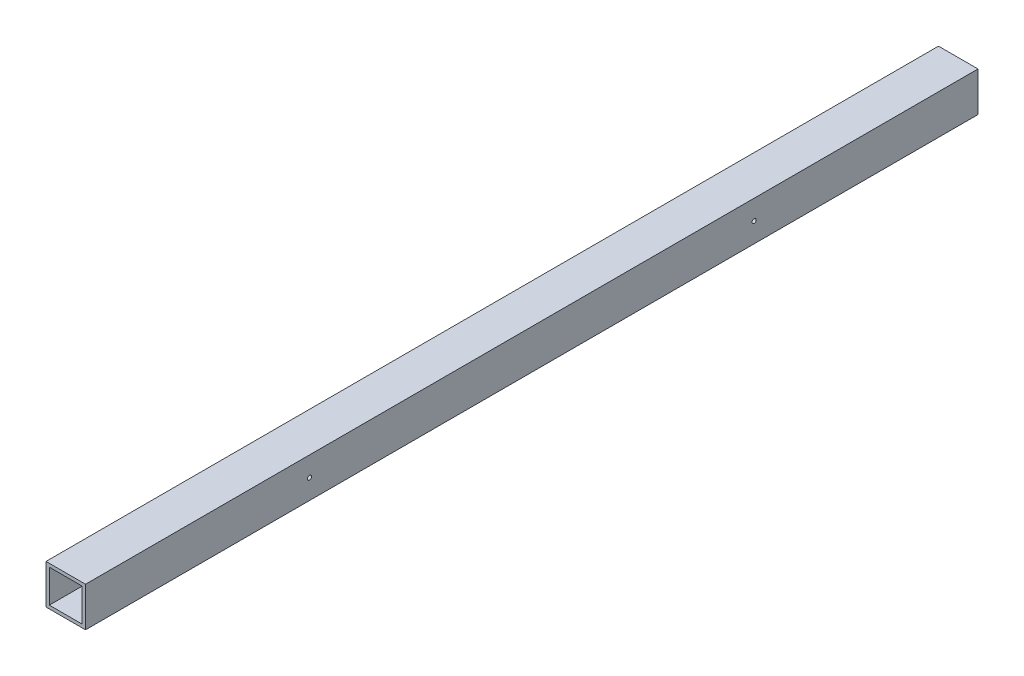
ISO-10303-21;
HEADER;
FILE_DESCRIPTION(('STEP AP214'),'2;1');
FILE_NAME('part.step','',(''),(''),'','','');
FILE_SCHEMA(('AUTOMOTIVE_DESIGN { 1 0 10303 214 1 1 1 1 }'));
ENDSEC;
DATA;
#1=APPLICATION_CONTEXT('core data for automotive mechanical design processes');
#2=APPLICATION_PROTOCOL_DEFINITION('international standard','automotive_design',2000,#1);
#3=PRODUCT_CONTEXT('',#1,'mechanical');
#4=PRODUCT('Part','Part','',(#3));
#5=PRODUCT_RELATED_PRODUCT_CATEGORY('part','',(#4));
#6=PRODUCT_DEFINITION_FORMATION('','',#4);
#7=PRODUCT_DEFINITION_CONTEXT('part definition',#1,'design');
#8=PRODUCT_DEFINITION('design','',#6,#7);
#9=PRODUCT_DEFINITION_SHAPE('','',#8);
#10=(LENGTH_UNIT() NAMED_UNIT(*) SI_UNIT(.MILLI.,.METRE.));
#11=(NAMED_UNIT(*) PLANE_ANGLE_UNIT() SI_UNIT($,.RADIAN.));
#12=(NAMED_UNIT(*) SI_UNIT($,.STERADIAN.) SOLID_ANGLE_UNIT());
#13=UNCERTAINTY_MEASURE_WITH_UNIT(LENGTH_MEASURE(1.E-05),#10,'distance_accuracy_value','');
#14=(GEOMETRIC_REPRESENTATION_CONTEXT(3) GLOBAL_UNCERTAINTY_ASSIGNED_CONTEXT((#13)) GLOBAL_UNIT_ASSIGNED_CONTEXT((#10,
#11,#12)) REPRESENTATION_CONTEXT('',''));
#15=CARTESIAN_POINT('',(0.,0.,0.));
#16=DIRECTION('',(0.,0.,1.));
#17=DIRECTION('',(1.,0.,0.));
#18=AXIS2_PLACEMENT_3D('',#15,#16,#17);
#19=CARTESIAN_POINT('',(0.,0.,271.));
#20=DIRECTION('',(0.,0.,1.));
#21=DIRECTION('',(1.,0.,0.));
#22=AXIS2_PLACEMENT_3D('',#19,#20,#21);
#23=PLANE('',#22);
#24=DIRECTION('',(0.,-1.,0.));
#25=VECTOR('',#24,1.);
#26=CARTESIAN_POINT('',(-12.,12.,271.));
#27=LINE('',#26,#25);
#28=CARTESIAN_POINT('',(-12.,12.,271.));
#29=VERTEX_POINT('',#28);
#30=CARTESIAN_POINT('',(-12.,-12.,271.));
#31=VERTEX_POINT('',#30);
#32=EDGE_CURVE('E139',#29,#31,#27,.T.);
#33=ORIENTED_EDGE('',*,*,#32,.T.);
#34=DIRECTION('',(1.,0.,0.));
#35=VECTOR('',#34,1.);
#36=CARTESIAN_POINT('',(-12.,-12.,271.));
#37=LINE('',#36,#35);
#38=CARTESIAN_POINT('',(12.,-12.,271.));
#39=VERTEX_POINT('',#38);
#40=EDGE_CURVE('E142',#31,#39,#37,.T.);
#41=ORIENTED_EDGE('',*,*,#40,.T.);
#42=DIRECTION('',(0.,1.,0.));
#43=VECTOR('',#42,1.);
#44=CARTESIAN_POINT('',(12.,12.,271.));
#45=LINE('',#44,#43);
#46=CARTESIAN_POINT('',(12.,12.,271.));
#47=VERTEX_POINT('',#46);
#48=EDGE_CURVE('E145',#39,#47,#45,.T.);
#49=ORIENTED_EDGE('',*,*,#48,.T.);
#50=DIRECTION('',(-1.,0.,0.));
#51=VECTOR('',#50,1.);
#52=CARTESIAN_POINT('',(-12.,12.,271.));
#53=LINE('',#52,#51);
#54=EDGE_CURVE('E147',#47,#29,#53,.T.);
#55=ORIENTED_EDGE('',*,*,#54,.T.);
#56=EDGE_LOOP('',(#33,#41,#49,#55));
#57=FACE_BOUND('',#56,.T.);
#58=DIRECTION('',(-1.,0.,0.));
#59=VECTOR('',#58,1.);
#60=CARTESIAN_POINT('',(-10.,10.,271.));
#61=LINE('',#60,#59);
#62=CARTESIAN_POINT('',(10.,10.,271.));
#63=VERTEX_POINT('',#62);
#64=CARTESIAN_POINT('',(-10.,10.,271.));
#65=VERTEX_POINT('',#64);
#66=EDGE_CURVE('E109',#63,#65,#61,.T.);
#67=ORIENTED_EDGE('',*,*,#66,.F.);
#68=DIRECTION('',(0.,1.,0.));
#69=VECTOR('',#68,1.);
#70=CARTESIAN_POINT('',(10.,10.,271.));
#71=LINE('',#70,#69);
#72=CARTESIAN_POINT('',(10.,-10.,271.));
#73=VERTEX_POINT('',#72);
#74=EDGE_CURVE('E101',#73,#63,#71,.T.);
#75=ORIENTED_EDGE('',*,*,#74,.F.);
#76=DIRECTION('',(1.,0.,0.));
#77=VECTOR('',#76,1.);
#78=CARTESIAN_POINT('',(-10.,-10.,271.));
#79=LINE('',#78,#77);
#80=CARTESIAN_POINT('',(-10.,-10.,271.));
#81=VERTEX_POINT('',#80);
#82=EDGE_CURVE('E123',#81,#73,#79,.T.);
#83=ORIENTED_EDGE('',*,*,#82,.F.);
#84=DIRECTION('',(0.,-1.,0.));
#85=VECTOR('',#84,1.);
#86=CARTESIAN_POINT('',(-10.,10.,271.));
#87=LINE('',#86,#85);
#88=EDGE_CURVE('E121',#65,#81,#87,.T.);
#89=ORIENTED_EDGE('',*,*,#88,.F.);
#90=EDGE_LOOP('',(#67,#75,#83,#89));
#91=FACE_BOUND('',#90,.T.);
#92=ADVANCED_FACE('F35',(#57,#91),#23,.T.);
#93=CARTESIAN_POINT('',(0.,0.,-271.));
#94=DIRECTION('',(0.,0.,1.));
#95=DIRECTION('',(1.,0.,0.));
#96=AXIS2_PLACEMENT_3D('',#93,#94,#95);
#97=PLANE('',#96);
#98=DIRECTION('',(0.,-1.,0.));
#99=VECTOR('',#98,1.);
#100=CARTESIAN_POINT('',(-12.,12.,-271.));
#101=LINE('',#100,#99);
#102=CARTESIAN_POINT('',(-12.,12.,-271.));
#103=VERTEX_POINT('',#102);
#104=CARTESIAN_POINT('',(-12.,-12.,-271.));
#105=VERTEX_POINT('',#104);
#106=EDGE_CURVE('E117',#103,#105,#101,.T.);
#107=ORIENTED_EDGE('',*,*,#106,.F.);
#108=DIRECTION('',(-1.,0.,0.));
#109=VECTOR('',#108,1.);
#110=CARTESIAN_POINT('',(-12.,12.,-271.));
#111=LINE('',#110,#109);
#112=CARTESIAN_POINT('',(12.,12.,-271.));
#113=VERTEX_POINT('',#112);
#114=EDGE_CURVE('E143',#113,#103,#111,.T.);
#115=ORIENTED_EDGE('',*,*,#114,.F.);
#116=DIRECTION('',(0.,1.,0.));
#117=VECTOR('',#116,1.);
#118=CARTESIAN_POINT('',(12.,12.,-271.));
#119=LINE('',#118,#117);
#120=CARTESIAN_POINT('',(12.,-12.,-271.));
#121=VERTEX_POINT('',#120);
#122=EDGE_CURVE('E154',#121,#113,#119,.T.);
#123=ORIENTED_EDGE('',*,*,#122,.F.);
#124=DIRECTION('',(1.,0.,0.));
#125=VECTOR('',#124,1.);
#126=CARTESIAN_POINT('',(-12.,-12.,-271.));
#127=LINE('',#126,#125);
#128=EDGE_CURVE('E152',#105,#121,#127,.T.);
#129=ORIENTED_EDGE('',*,*,#128,.F.);
#130=EDGE_LOOP('',(#107,#115,#123,#129));
#131=FACE_BOUND('',#130,.T.);
#132=DIRECTION('',(0.,1.,0.));
#133=VECTOR('',#132,1.);
#134=CARTESIAN_POINT('',(10.,10.,-271.));
#135=LINE('',#134,#133);
#136=CARTESIAN_POINT('',(10.,-10.,-271.));
#137=VERTEX_POINT('',#136);
#138=CARTESIAN_POINT('',(10.,10.,-271.));
#139=VERTEX_POINT('',#138);
#140=EDGE_CURVE('E59',#137,#139,#135,.T.);
#141=ORIENTED_EDGE('',*,*,#140,.T.);
#142=DIRECTION('',(-1.,0.,0.));
#143=VECTOR('',#142,1.);
#144=CARTESIAN_POINT('',(-10.,10.,-271.));
#145=LINE('',#144,#143);
#146=CARTESIAN_POINT('',(-10.,10.,-271.));
#147=VERTEX_POINT('',#146);
#148=EDGE_CURVE('E116',#139,#147,#145,.T.);
#149=ORIENTED_EDGE('',*,*,#148,.T.);
#150=DIRECTION('',(0.,-1.,0.));
#151=VECTOR('',#150,1.);
#152=CARTESIAN_POINT('',(-10.,10.,-271.));
#153=LINE('',#152,#151);
#154=CARTESIAN_POINT('',(-10.,-10.,-271.));
#155=VERTEX_POINT('',#154);
#156=EDGE_CURVE('E131',#147,#155,#153,.T.);
#157=ORIENTED_EDGE('',*,*,#156,.T.);
#158=DIRECTION('',(1.,0.,0.));
#159=VECTOR('',#158,1.);
#160=CARTESIAN_POINT('',(-10.,-10.,-271.));
#161=LINE('',#160,#159);
#162=EDGE_CURVE('E110',#155,#137,#161,.T.);
#163=ORIENTED_EDGE('',*,*,#162,.T.);
#164=EDGE_LOOP('',(#141,#149,#157,#163));
#165=FACE_BOUND('',#164,.T.);
#166=ADVANCED_FACE('F173',(#131,#165),#97,.F.);
#167=CARTESIAN_POINT('',(-12.,12.,271.));
#168=DIRECTION('',(1.,0.,0.));
#169=DIRECTION('',(0.,1.,0.));
#170=AXIS2_PLACEMENT_3D('',#167,#168,#169);
#171=PLANE('',#170);
#172=CARTESIAN_POINT('',(-12.,0.,135.));
#173=DIRECTION('',(-1.,0.,0.));
#174=DIRECTION('',(0.,0.,1.));
#175=AXIS2_PLACEMENT_3D('',#172,#173,#174);
#176=CIRCLE('',#175,1.24999999999999);
#177=CARTESIAN_POINT('',(-12.,0.,136.25));
#178=VERTEX_POINT('',#177);
#179=EDGE_CURVE('E231',#178,#178,#176,.T.);
#180=ORIENTED_EDGE('',*,*,#179,.F.);
#181=EDGE_LOOP('',(#180));
#182=FACE_BOUND('',#181,.T.);
#183=CARTESIAN_POINT('',(-12.,0.,-135.));
#184=DIRECTION('',(-1.,0.,0.));
#185=DIRECTION('',(0.,0.,1.));
#186=AXIS2_PLACEMENT_3D('',#183,#184,#185);
#187=CIRCLE('',#186,1.24999999999999);
#188=CARTESIAN_POINT('',(-12.,0.,-133.75));
#189=VERTEX_POINT('',#188);
#190=EDGE_CURVE('E224',#189,#189,#187,.T.);
#191=ORIENTED_EDGE('',*,*,#190,.F.);
#192=EDGE_LOOP('',(#191));
#193=FACE_BOUND('',#192,.T.);
#194=ORIENTED_EDGE('',*,*,#106,.T.);
#195=DIRECTION('',(0.,0.,-1.));
#196=VECTOR('',#195,1.);
#197=CARTESIAN_POINT('',(-12.,-12.,271.));
#198=LINE('',#197,#196);
#199=EDGE_CURVE('E11',#31,#105,#198,.T.);
#200=ORIENTED_EDGE('',*,*,#199,.F.);
#201=ORIENTED_EDGE('',*,*,#32,.F.);
#202=DIRECTION('',(0.,0.,-1.));
#203=VECTOR('',#202,1.);
#204=CARTESIAN_POINT('',(-12.,12.,271.));
#205=LINE('',#204,#203);
#206=EDGE_CURVE('E149',#29,#103,#205,.T.);
#207=ORIENTED_EDGE('',*,*,#206,.T.);
#208=EDGE_LOOP('',(#194,#200,#201,#207));
#209=FACE_BOUND('',#208,.T.);
#210=ADVANCED_FACE('F37',(#182,#193,#209),#171,.F.);
#211=CARTESIAN_POINT('',(-12.,-12.,271.));
#212=DIRECTION('',(0.,1.,0.));
#213=DIRECTION('',(-1.,0.,0.));
#214=AXIS2_PLACEMENT_3D('',#211,#212,#213);
#215=PLANE('',#214);
#216=ORIENTED_EDGE('',*,*,#128,.T.);
#217=DIRECTION('',(0.,0.,-1.));
#218=VECTOR('',#217,1.);
#219=CARTESIAN_POINT('',(12.,-12.,271.));
#220=LINE('',#219,#218);
#221=EDGE_CURVE('E44',#39,#121,#220,.T.);
#222=ORIENTED_EDGE('',*,*,#221,.F.);
#223=ORIENTED_EDGE('',*,*,#40,.F.);
#224=ORIENTED_EDGE('',*,*,#199,.T.);
#225=EDGE_LOOP('',(#216,#222,#223,#224));
#226=FACE_BOUND('',#225,.T.);
#227=ADVANCED_FACE('F183',(#226),#215,.F.);
#228=CARTESIAN_POINT('',(12.,12.,271.));
#229=DIRECTION('',(-1.,0.,0.));
#230=DIRECTION('',(0.,-1.,0.));
#231=AXIS2_PLACEMENT_3D('',#228,#229,#230);
#232=PLANE('',#231);
#233=CARTESIAN_POINT('',(12.,0.,135.));
#234=DIRECTION('',(-1.,0.,0.));
#235=DIRECTION('',(0.,0.,1.));
#236=AXIS2_PLACEMENT_3D('',#233,#234,#235);
#237=CIRCLE('',#236,1.24999999999998);
#238=CARTESIAN_POINT('',(12.,0.,136.25));
#239=VERTEX_POINT('',#238);
#240=EDGE_CURVE('E228',#239,#239,#237,.T.);
#241=ORIENTED_EDGE('',*,*,#240,.T.);
#242=EDGE_LOOP('',(#241));
#243=FACE_BOUND('',#242,.T.);
#244=CARTESIAN_POINT('',(12.,0.,-135.));
#245=DIRECTION('',(-1.,0.,0.));
#246=DIRECTION('',(0.,0.,1.));
#247=AXIS2_PLACEMENT_3D('',#244,#245,#246);
#248=CIRCLE('',#247,1.24999999999998);
#249=CARTESIAN_POINT('',(12.,0.,-133.75));
#250=VERTEX_POINT('',#249);
#251=EDGE_CURVE('E219',#250,#250,#248,.T.);
#252=ORIENTED_EDGE('',*,*,#251,.T.);
#253=EDGE_LOOP('',(#252));
#254=FACE_BOUND('',#253,.T.);
#255=ORIENTED_EDGE('',*,*,#122,.T.);
#256=DIRECTION('',(0.,0.,-1.));
#257=VECTOR('',#256,1.);
#258=CARTESIAN_POINT('',(12.,12.,271.));
#259=LINE('',#258,#257);
#260=EDGE_CURVE('E159',#47,#113,#259,.T.);
#261=ORIENTED_EDGE('',*,*,#260,.F.);
#262=ORIENTED_EDGE('',*,*,#48,.F.);
#263=ORIENTED_EDGE('',*,*,#221,.T.);
#264=EDGE_LOOP('',(#255,#261,#262,#263));
#265=FACE_BOUND('',#264,.T.);
#266=ADVANCED_FACE('F167',(#243,#254,#265),#232,.F.);
#267=CARTESIAN_POINT('',(-12.,12.,271.));
#268=DIRECTION('',(0.,-1.,0.));
#269=DIRECTION('',(0.,0.,-1.));
#270=AXIS2_PLACEMENT_3D('',#267,#268,#269);
#271=PLANE('',#270);
#272=ORIENTED_EDGE('',*,*,#114,.T.);
#273=ORIENTED_EDGE('',*,*,#206,.F.);
#274=ORIENTED_EDGE('',*,*,#54,.F.);
#275=ORIENTED_EDGE('',*,*,#260,.T.);
#276=EDGE_LOOP('',(#272,#273,#274,#275));
#277=FACE_BOUND('',#276,.T.);
#278=ADVANCED_FACE('F177',(#277),#271,.F.);
#279=CARTESIAN_POINT('',(10.,10.,271.));
#280=DIRECTION('',(-1.,0.,0.));
#281=DIRECTION('',(0.,0.,1.));
#282=AXIS2_PLACEMENT_3D('',#279,#280,#281);
#283=PLANE('',#282);
#284=CARTESIAN_POINT('',(10.,0.,135.));
#285=DIRECTION('',(-1.,0.,0.));
#286=DIRECTION('',(0.,0.,1.));
#287=AXIS2_PLACEMENT_3D('',#284,#285,#286);
#288=CIRCLE('',#287,1.24999999999999);
#289=CARTESIAN_POINT('',(10.,0.,136.25));
#290=VERTEX_POINT('',#289);
#291=EDGE_CURVE('E213',#290,#290,#288,.T.);
#292=ORIENTED_EDGE('',*,*,#291,.F.);
#293=EDGE_LOOP('',(#292));
#294=FACE_BOUND('',#293,.T.);
#295=CARTESIAN_POINT('',(10.,0.,-135.));
#296=DIRECTION('',(-1.,0.,0.));
#297=DIRECTION('',(0.,0.,1.));
#298=AXIS2_PLACEMENT_3D('',#295,#296,#297);
#299=CIRCLE('',#298,1.24999999999999);
#300=CARTESIAN_POINT('',(10.,0.,-133.75));
#301=VERTEX_POINT('',#300);
#302=EDGE_CURVE('E129',#301,#301,#299,.T.);
#303=ORIENTED_EDGE('',*,*,#302,.F.);
#304=EDGE_LOOP('',(#303));
#305=FACE_BOUND('',#304,.T.);
#306=ORIENTED_EDGE('',*,*,#140,.F.);
#307=DIRECTION('',(0.,0.,-1.));
#308=VECTOR('',#307,1.);
#309=CARTESIAN_POINT('',(10.,-10.,271.));
#310=LINE('',#309,#308);
#311=EDGE_CURVE('E105',#73,#137,#310,.T.);
#312=ORIENTED_EDGE('',*,*,#311,.F.);
#313=ORIENTED_EDGE('',*,*,#74,.T.);
#314=DIRECTION('',(0.,0.,-1.));
#315=VECTOR('',#314,1.);
#316=CARTESIAN_POINT('',(10.,10.,271.));
#317=LINE('',#316,#315);
#318=EDGE_CURVE('E104',#63,#139,#317,.T.);
#319=ORIENTED_EDGE('',*,*,#318,.T.);
#320=EDGE_LOOP('',(#306,#312,#313,#319));
#321=FACE_BOUND('',#320,.T.);
#322=ADVANCED_FACE('F103',(#294,#305,#321),#283,.T.);
#323=CARTESIAN_POINT('',(-10.,10.,271.));
#324=DIRECTION('',(0.,-1.,0.));
#325=DIRECTION('',(0.,0.,-1.));
#326=AXIS2_PLACEMENT_3D('',#323,#324,#325);
#327=PLANE('',#326);
#328=ORIENTED_EDGE('',*,*,#148,.F.);
#329=ORIENTED_EDGE('',*,*,#318,.F.);
#330=ORIENTED_EDGE('',*,*,#66,.T.);
#331=DIRECTION('',(0.,0.,-1.));
#332=VECTOR('',#331,1.);
#333=CARTESIAN_POINT('',(-10.,10.,271.));
#334=LINE('',#333,#332);
#335=EDGE_CURVE('E118',#65,#147,#334,.T.);
#336=ORIENTED_EDGE('',*,*,#335,.T.);
#337=EDGE_LOOP('',(#328,#329,#330,#336));
#338=FACE_BOUND('',#337,.T.);
#339=ADVANCED_FACE('F113',(#338),#327,.T.);
#340=CARTESIAN_POINT('',(-10.,10.,271.));
#341=DIRECTION('',(1.,0.,0.));
#342=DIRECTION('',(0.,1.,0.));
#343=AXIS2_PLACEMENT_3D('',#340,#341,#342);
#344=PLANE('',#343);
#345=CARTESIAN_POINT('',(-10.,0.,135.));
#346=DIRECTION('',(1.,0.,0.));
#347=DIRECTION('',(0.,1.,0.));
#348=AXIS2_PLACEMENT_3D('',#345,#346,#347);
#349=CIRCLE('',#348,1.24999999999999);
#350=CARTESIAN_POINT('',(-10.,1.24999999999998,135.));
#351=VERTEX_POINT('',#350);
#352=EDGE_CURVE('E39',#351,#351,#349,.T.);
#353=ORIENTED_EDGE('',*,*,#352,.F.);
#354=EDGE_LOOP('',(#353));
#355=FACE_BOUND('',#354,.T.);
#356=CARTESIAN_POINT('',(-10.,0.,-135.));
#357=DIRECTION('',(1.,0.,0.));
#358=DIRECTION('',(0.,1.,0.));
#359=AXIS2_PLACEMENT_3D('',#356,#357,#358);
#360=CIRCLE('',#359,1.24999999999999);
#361=CARTESIAN_POINT('',(-10.,1.24999999999998,-135.));
#362=VERTEX_POINT('',#361);
#363=EDGE_CURVE('E217',#362,#362,#360,.T.);
#364=ORIENTED_EDGE('',*,*,#363,.F.);
#365=EDGE_LOOP('',(#364));
#366=FACE_BOUND('',#365,.T.);
#367=ORIENTED_EDGE('',*,*,#156,.F.);
#368=ORIENTED_EDGE('',*,*,#335,.F.);
#369=ORIENTED_EDGE('',*,*,#88,.T.);
#370=DIRECTION('',(0.,0.,-1.));
#371=VECTOR('',#370,1.);
#372=CARTESIAN_POINT('',(-10.,-10.,271.));
#373=LINE('',#372,#371);
#374=EDGE_CURVE('E51',#81,#155,#373,.T.);
#375=ORIENTED_EDGE('',*,*,#374,.T.);
#376=EDGE_LOOP('',(#367,#368,#369,#375));
#377=FACE_BOUND('',#376,.T.);
#378=ADVANCED_FACE('F209',(#355,#366,#377),#344,.T.);
#379=CARTESIAN_POINT('',(-10.,-10.,271.));
#380=DIRECTION('',(0.,1.,0.));
#381=DIRECTION('',(0.,0.,1.));
#382=AXIS2_PLACEMENT_3D('',#379,#380,#381);
#383=PLANE('',#382);
#384=ORIENTED_EDGE('',*,*,#162,.F.);
#385=ORIENTED_EDGE('',*,*,#374,.F.);
#386=ORIENTED_EDGE('',*,*,#82,.T.);
#387=ORIENTED_EDGE('',*,*,#311,.T.);
#388=EDGE_LOOP('',(#384,#385,#386,#387));
#389=FACE_BOUND('',#388,.T.);
#390=ADVANCED_FACE('F242',(#389),#383,.T.);
#391=CARTESIAN_POINT('',(-12.,0.,-135.));
#392=DIRECTION('',(-1.,0.,0.));
#393=DIRECTION('',(0.,0.,1.));
#394=AXIS2_PLACEMENT_3D('',#391,#392,#393);
#395=CYLINDRICAL_SURFACE('',#394,1.24999999999999);
#396=ORIENTED_EDGE('',*,*,#363,.T.);
#397=EDGE_LOOP('',(#396));
#398=FACE_BOUND('',#397,.T.);
#399=ORIENTED_EDGE('',*,*,#190,.T.);
#400=EDGE_LOOP('',(#399));
#401=FACE_BOUND('',#400,.T.);
#402=ADVANCED_FACE('F239',(#398,#401),#395,.F.);
#403=ORIENTED_EDGE('',*,*,#302,.T.);
#404=EDGE_LOOP('',(#403));
#405=FACE_BOUND('',#404,.T.);
#406=ORIENTED_EDGE('',*,*,#251,.F.);
#407=EDGE_LOOP('',(#406));
#408=FACE_BOUND('',#407,.T.);
#409=ADVANCED_FACE('F241',(#405,#408),#395,.F.);
#410=CARTESIAN_POINT('',(-12.,0.,135.));
#411=DIRECTION('',(-1.,0.,0.));
#412=DIRECTION('',(0.,0.,1.));
#413=AXIS2_PLACEMENT_3D('',#410,#411,#412);
#414=CYLINDRICAL_SURFACE('',#413,1.24999999999999);
#415=ORIENTED_EDGE('',*,*,#352,.T.);
#416=EDGE_LOOP('',(#415));
#417=FACE_BOUND('',#416,.T.);
#418=ORIENTED_EDGE('',*,*,#179,.T.);
#419=EDGE_LOOP('',(#418));
#420=FACE_BOUND('',#419,.T.);
#421=ADVANCED_FACE('F235',(#417,#420),#414,.F.);
#422=ORIENTED_EDGE('',*,*,#291,.T.);
#423=EDGE_LOOP('',(#422));
#424=FACE_BOUND('',#423,.T.);
#425=ORIENTED_EDGE('',*,*,#240,.F.);
#426=EDGE_LOOP('',(#425));
#427=FACE_BOUND('',#426,.T.);
#428=ADVANCED_FACE('F264',(#424,#427),#414,.F.);
#429=CLOSED_SHELL('',(#92,#166,#210,#227,#266,#278,#322,#339,#378,#390,#402,#409,#421,#428));
#430=MANIFOLD_SOLID_BREP('B2',#429);
#431=ADVANCED_BREP_SHAPE_REPRESENTATION('',(#18,#430),#14);
#432=SHAPE_DEFINITION_REPRESENTATION(#9,#431);
ENDSEC;
END-ISO-10303-21;
